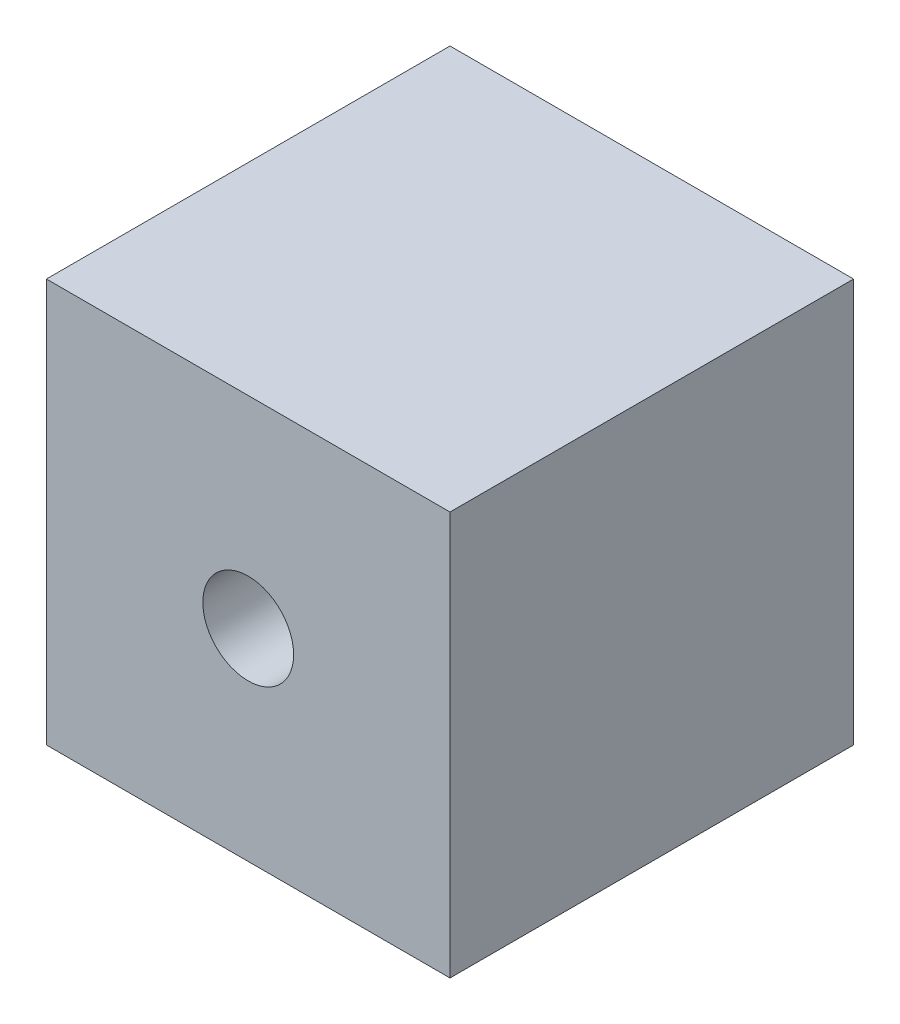
ISO-10303-21;
HEADER;
FILE_DESCRIPTION(('STEP AP214'),'2;1');
FILE_NAME('part.step','',(''),(''),'','','');
FILE_SCHEMA(('AUTOMOTIVE_DESIGN { 1 0 10303 214 1 1 1 1 }'));
ENDSEC;
DATA;
#1=APPLICATION_CONTEXT('core data for automotive mechanical design processes');
#2=APPLICATION_PROTOCOL_DEFINITION('international standard','automotive_design',2000,#1);
#3=PRODUCT_CONTEXT('',#1,'mechanical');
#4=PRODUCT('Part','Part','',(#3));
#5=PRODUCT_RELATED_PRODUCT_CATEGORY('part','',(#4));
#6=PRODUCT_DEFINITION_FORMATION('','',#4);
#7=PRODUCT_DEFINITION_CONTEXT('part definition',#1,'design');
#8=PRODUCT_DEFINITION('design','',#6,#7);
#9=PRODUCT_DEFINITION_SHAPE('','',#8);
#10=(LENGTH_UNIT() NAMED_UNIT(*) SI_UNIT(.MILLI.,.METRE.));
#11=(NAMED_UNIT(*) PLANE_ANGLE_UNIT() SI_UNIT($,.RADIAN.));
#12=(NAMED_UNIT(*) SI_UNIT($,.STERADIAN.) SOLID_ANGLE_UNIT());
#13=UNCERTAINTY_MEASURE_WITH_UNIT(LENGTH_MEASURE(1.E-05),#10,'distance_accuracy_value','');
#14=(GEOMETRIC_REPRESENTATION_CONTEXT(3) GLOBAL_UNCERTAINTY_ASSIGNED_CONTEXT((#13)) GLOBAL_UNIT_ASSIGNED_CONTEXT((#10,
#11,#12)) REPRESENTATION_CONTEXT('',''));
#15=CARTESIAN_POINT('',(0.,0.,0.));
#16=DIRECTION('',(0.,0.,1.));
#17=DIRECTION('',(1.,0.,0.));
#18=AXIS2_PLACEMENT_3D('',#15,#16,#17);
#19=CARTESIAN_POINT('',(-10392.3904035081,-4733.40551359016,146.));
#20=DIRECTION('',(0.,0.,1.));
#21=DIRECTION('',(1.,0.,0.));
#22=AXIS2_PLACEMENT_3D('',#19,#20,#21);
#23=PLANE('',#22);
#24=DIRECTION('',(1.,0.,0.));
#25=VECTOR('',#24,1.);
#26=CARTESIAN_POINT('',(-10392.3804035081,-4733.39551359016,146.));
#27=LINE('',#26,#25);
#28=CARTESIAN_POINT('',(-10392.3804035081,-4733.39551359016,146.));
#29=VERTEX_POINT('',#28);
#30=CARTESIAN_POINT('',(-10352.3804035081,-4733.39551359016,146.));
#31=VERTEX_POINT('',#30);
#32=EDGE_CURVE('E9',#29,#31,#27,.T.);
#33=ORIENTED_EDGE('',*,*,#32,.T.);
#34=DIRECTION('',(0.,1.,0.));
#35=VECTOR('',#34,1.);
#36=CARTESIAN_POINT('',(-10352.3804035081,-4733.39551359016,146.));
#37=LINE('',#36,#35);
#38=CARTESIAN_POINT('',(-10352.3804035081,-4693.39551359016,146.));
#39=VERTEX_POINT('',#38);
#40=EDGE_CURVE('E25',#31,#39,#37,.T.);
#41=ORIENTED_EDGE('',*,*,#40,.T.);
#42=DIRECTION('',(-1.,0.,0.));
#43=VECTOR('',#42,1.);
#44=CARTESIAN_POINT('',(-10392.3804035081,-4693.39551359016,146.));
#45=LINE('',#44,#43);
#46=CARTESIAN_POINT('',(-10392.3804035081,-4693.39551359016,146.));
#47=VERTEX_POINT('',#46);
#48=EDGE_CURVE('E73',#39,#47,#45,.T.);
#49=ORIENTED_EDGE('',*,*,#48,.T.);
#50=DIRECTION('',(0.,-1.,0.));
#51=VECTOR('',#50,1.);
#52=CARTESIAN_POINT('',(-10392.3804035081,-4733.39551359016,146.));
#53=LINE('',#52,#51);
#54=EDGE_CURVE('E85',#47,#29,#53,.T.);
#55=ORIENTED_EDGE('',*,*,#54,.T.);
#56=EDGE_LOOP('',(#33,#41,#49,#55));
#57=FACE_BOUND('',#56,.T.);
#58=CARTESIAN_POINT('',(-10372.3804035081,-4713.39551359016,146.));
#59=DIRECTION('',(0.,0.,1.));
#60=DIRECTION('',(1.,0.,0.));
#61=AXIS2_PLACEMENT_3D('',#58,#59,#60);
#62=CIRCLE('',#61,4.50000000000013);
#63=CARTESIAN_POINT('',(-10367.8804035081,-4713.39551359016,146.));
#64=VERTEX_POINT('',#63);
#65=EDGE_CURVE('E74',#64,#64,#62,.T.);
#66=ORIENTED_EDGE('',*,*,#65,.F.);
#67=EDGE_LOOP('',(#66));
#68=FACE_BOUND('',#67,.T.);
#69=ADVANCED_FACE('F15',(#57,#68),#23,.T.);
#70=CARTESIAN_POINT('',(-10392.3904035081,-4733.40551359016,106.));
#71=DIRECTION('',(0.,0.,-1.));
#72=DIRECTION('',(-1.,0.,0.));
#73=AXIS2_PLACEMENT_3D('',#70,#71,#72);
#74=PLANE('',#73);
#75=DIRECTION('',(1.,0.,0.));
#76=VECTOR('',#75,1.);
#77=CARTESIAN_POINT('',(-10392.3804035081,-4733.39551359016,106.));
#78=LINE('',#77,#76);
#79=CARTESIAN_POINT('',(-10392.3804035081,-4733.39551359016,106.));
#80=VERTEX_POINT('',#79);
#81=CARTESIAN_POINT('',(-10352.3804035081,-4733.39551359016,106.));
#82=VERTEX_POINT('',#81);
#83=EDGE_CURVE('E89',#80,#82,#78,.T.);
#84=ORIENTED_EDGE('',*,*,#83,.F.);
#85=DIRECTION('',(0.,-1.,0.));
#86=VECTOR('',#85,1.);
#87=CARTESIAN_POINT('',(-10392.3804035081,-4733.39551359016,106.));
#88=LINE('',#87,#86);
#89=CARTESIAN_POINT('',(-10392.3804035081,-4693.39551359016,106.));
#90=VERTEX_POINT('',#89);
#91=EDGE_CURVE('E67',#90,#80,#88,.T.);
#92=ORIENTED_EDGE('',*,*,#91,.F.);
#93=DIRECTION('',(-1.,0.,0.));
#94=VECTOR('',#93,1.);
#95=CARTESIAN_POINT('',(-10392.3804035081,-4693.39551359016,106.));
#96=LINE('',#95,#94);
#97=CARTESIAN_POINT('',(-10352.3804035081,-4693.39551359016,106.));
#98=VERTEX_POINT('',#97);
#99=EDGE_CURVE('E53',#98,#90,#96,.T.);
#100=ORIENTED_EDGE('',*,*,#99,.F.);
#101=DIRECTION('',(0.,1.,0.));
#102=VECTOR('',#101,1.);
#103=CARTESIAN_POINT('',(-10352.3804035081,-4733.39551359016,106.));
#104=LINE('',#103,#102);
#105=EDGE_CURVE('E56',#82,#98,#104,.T.);
#106=ORIENTED_EDGE('',*,*,#105,.F.);
#107=EDGE_LOOP('',(#84,#92,#100,#106));
#108=FACE_BOUND('',#107,.T.);
#109=CARTESIAN_POINT('',(-10372.3804035081,-4713.39551359016,106.));
#110=DIRECTION('',(0.,0.,-1.));
#111=DIRECTION('',(0.,-1.,0.));
#112=AXIS2_PLACEMENT_3D('',#109,#110,#111);
#113=CIRCLE('',#112,4.50000000000017);
#114=CARTESIAN_POINT('',(-10372.3804035081,-4717.89551359016,106.));
#115=VERTEX_POINT('',#114);
#116=EDGE_CURVE('E77',#115,#115,#113,.T.);
#117=ORIENTED_EDGE('',*,*,#116,.F.);
#118=EDGE_LOOP('',(#117));
#119=FACE_BOUND('',#118,.T.);
#120=ADVANCED_FACE('F65',(#108,#119),#74,.T.);
#121=CARTESIAN_POINT('',(-10392.3904035081,-4733.39551359016,105.99));
#122=DIRECTION('',(0.,-1.,0.));
#123=DIRECTION('',(0.,0.,-1.));
#124=AXIS2_PLACEMENT_3D('',#121,#122,#123);
#125=PLANE('',#124);
#126=ORIENTED_EDGE('',*,*,#83,.T.);
#127=DIRECTION('',(0.,0.,-1.));
#128=VECTOR('',#127,1.);
#129=CARTESIAN_POINT('',(-10352.3804035081,-4733.39551359016,106.));
#130=LINE('',#129,#128);
#131=EDGE_CURVE('E59',#31,#82,#130,.T.);
#132=ORIENTED_EDGE('',*,*,#131,.F.);
#133=ORIENTED_EDGE('',*,*,#32,.F.);
#134=DIRECTION('',(0.,0.,1.));
#135=VECTOR('',#134,1.);
#136=CARTESIAN_POINT('',(-10392.3804035081,-4733.39551359016,146.));
#137=LINE('',#136,#135);
#138=EDGE_CURVE('E69',#80,#29,#137,.T.);
#139=ORIENTED_EDGE('',*,*,#138,.F.);
#140=EDGE_LOOP('',(#126,#132,#133,#139));
#141=FACE_BOUND('',#140,.T.);
#142=ADVANCED_FACE('F97',(#141),#125,.T.);
#143=CARTESIAN_POINT('',(-10392.3804035081,-4733.40551359016,146.01));
#144=DIRECTION('',(-1.,0.,0.));
#145=DIRECTION('',(0.,0.,1.));
#146=AXIS2_PLACEMENT_3D('',#143,#144,#145);
#147=PLANE('',#146);
#148=ORIENTED_EDGE('',*,*,#91,.T.);
#149=ORIENTED_EDGE('',*,*,#138,.T.);
#150=ORIENTED_EDGE('',*,*,#54,.F.);
#151=DIRECTION('',(0.,0.,1.));
#152=VECTOR('',#151,1.);
#153=CARTESIAN_POINT('',(-10392.3804035081,-4693.39551359016,146.));
#154=LINE('',#153,#152);
#155=EDGE_CURVE('E63',#90,#47,#154,.T.);
#156=ORIENTED_EDGE('',*,*,#155,.F.);
#157=EDGE_LOOP('',(#148,#149,#150,#156));
#158=FACE_BOUND('',#157,.T.);
#159=ADVANCED_FACE('F83',(#158),#147,.T.);
#160=CARTESIAN_POINT('',(-10392.3904035081,-4693.39551359016,146.01));
#161=DIRECTION('',(0.,1.,0.));
#162=DIRECTION('',(0.,0.,1.));
#163=AXIS2_PLACEMENT_3D('',#160,#161,#162);
#164=PLANE('',#163);
#165=ORIENTED_EDGE('',*,*,#99,.T.);
#166=ORIENTED_EDGE('',*,*,#155,.T.);
#167=ORIENTED_EDGE('',*,*,#48,.F.);
#168=DIRECTION('',(0.,0.,1.));
#169=VECTOR('',#168,1.);
#170=CARTESIAN_POINT('',(-10352.3804035081,-4693.39551359016,106.));
#171=LINE('',#170,#169);
#172=EDGE_CURVE('E19',#98,#39,#171,.T.);
#173=ORIENTED_EDGE('',*,*,#172,.F.);
#174=EDGE_LOOP('',(#165,#166,#167,#173));
#175=FACE_BOUND('',#174,.T.);
#176=ADVANCED_FACE('F71',(#175),#164,.T.);
#177=CARTESIAN_POINT('',(-10352.3804035081,-4733.40551359016,105.99));
#178=DIRECTION('',(1.,0.,0.));
#179=DIRECTION('',(0.,0.,-1.));
#180=AXIS2_PLACEMENT_3D('',#177,#178,#179);
#181=PLANE('',#180);
#182=ORIENTED_EDGE('',*,*,#105,.T.);
#183=ORIENTED_EDGE('',*,*,#172,.T.);
#184=ORIENTED_EDGE('',*,*,#40,.F.);
#185=ORIENTED_EDGE('',*,*,#131,.T.);
#186=EDGE_LOOP('',(#182,#183,#184,#185));
#187=FACE_BOUND('',#186,.T.);
#188=ADVANCED_FACE('F57',(#187),#181,.T.);
#189=CARTESIAN_POINT('',(-10372.3804035081,-4713.39551359016,121.));
#190=DIRECTION('',(0.,0.,1.));
#191=DIRECTION('',(1.,0.,0.));
#192=AXIS2_PLACEMENT_3D('',#189,#190,#191);
#193=CYLINDRICAL_SURFACE('',#192,4.50000000000013);
#194=ORIENTED_EDGE('',*,*,#65,.T.);
#195=EDGE_LOOP('',(#194));
#196=FACE_BOUND('',#195,.T.);
#197=ORIENTED_EDGE('',*,*,#116,.T.);
#198=EDGE_LOOP('',(#197));
#199=FACE_BOUND('',#198,.T.);
#200=ADVANCED_FACE('F17',(#196,#199),#193,.F.);
#201=CLOSED_SHELL('',(#69,#120,#142,#159,#176,#188,#200));
#202=MANIFOLD_SOLID_BREP('B1',#201);
#203=ADVANCED_BREP_SHAPE_REPRESENTATION('',(#18,#202),#14);
#204=SHAPE_DEFINITION_REPRESENTATION(#9,#203);
ENDSEC;
END-ISO-10303-21;
